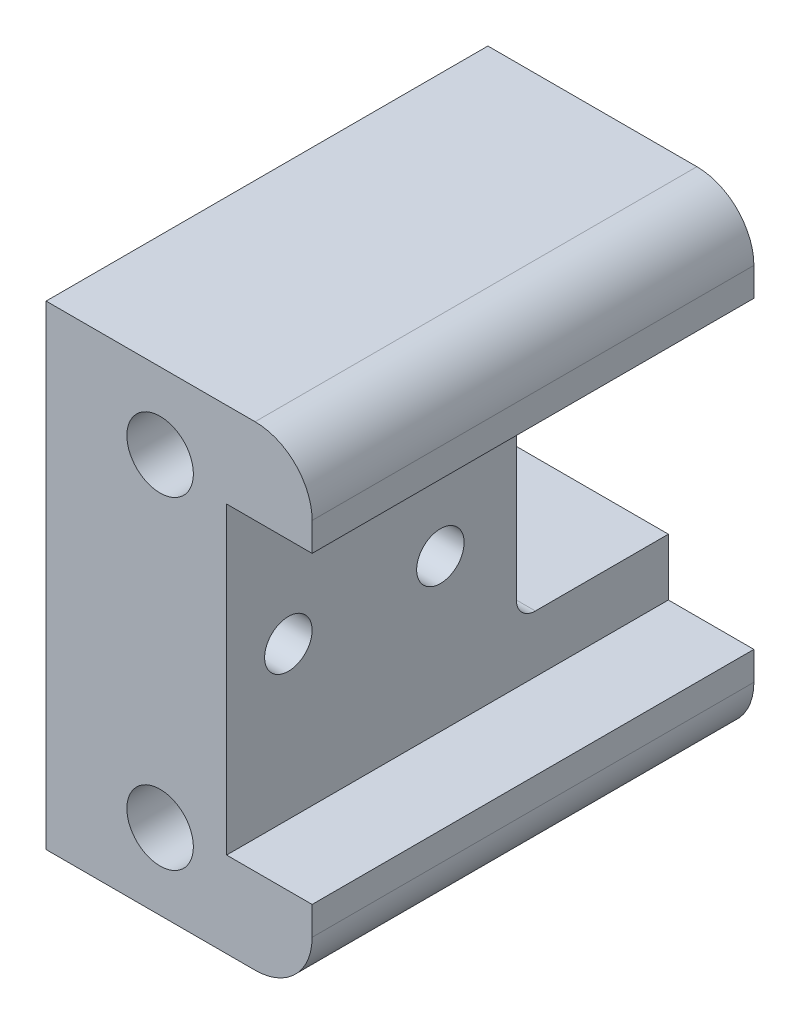
ISO-10303-21;
HEADER;
FILE_DESCRIPTION(('STEP AP214'),'2;1');
FILE_NAME('part.step','',(''),(''),'','','');
FILE_SCHEMA(('AUTOMOTIVE_DESIGN { 1 0 10303 214 1 1 1 1 }'));
ENDSEC;
DATA;
#1=APPLICATION_CONTEXT('core data for automotive mechanical design processes');
#2=APPLICATION_PROTOCOL_DEFINITION('international standard','automotive_design',2000,#1);
#3=PRODUCT_CONTEXT('',#1,'mechanical');
#4=PRODUCT('Part','Part','',(#3));
#5=PRODUCT_RELATED_PRODUCT_CATEGORY('part','',(#4));
#6=PRODUCT_DEFINITION_FORMATION('','',#4);
#7=PRODUCT_DEFINITION_CONTEXT('part definition',#1,'design');
#8=PRODUCT_DEFINITION('design','',#6,#7);
#9=PRODUCT_DEFINITION_SHAPE('','',#8);
#10=(LENGTH_UNIT() NAMED_UNIT(*) SI_UNIT(.MILLI.,.METRE.));
#11=(NAMED_UNIT(*) PLANE_ANGLE_UNIT() SI_UNIT($,.RADIAN.));
#12=(NAMED_UNIT(*) SI_UNIT($,.STERADIAN.) SOLID_ANGLE_UNIT());
#13=UNCERTAINTY_MEASURE_WITH_UNIT(LENGTH_MEASURE(1.E-05),#10,'distance_accuracy_value','');
#14=(GEOMETRIC_REPRESENTATION_CONTEXT(3) GLOBAL_UNCERTAINTY_ASSIGNED_CONTEXT((#13)) GLOBAL_UNIT_ASSIGNED_CONTEXT((#10,
#11,#12)) REPRESENTATION_CONTEXT('',''));
#15=CARTESIAN_POINT('',(0.,0.,0.));
#16=DIRECTION('',(0.,0.,1.));
#17=DIRECTION('',(1.,0.,0.));
#18=AXIS2_PLACEMENT_3D('',#15,#16,#17);
#19=CARTESIAN_POINT('',(-30.3635730743408,221.224854487221,423.302156001649));
#20=DIRECTION('',(1.,0.,0.));
#21=DIRECTION('',(0.,0.,-1.));
#22=AXIS2_PLACEMENT_3D('',#19,#20,#21);
#23=CYLINDRICAL_SURFACE('',#22,1.25);
#24=CARTESIAN_POINT('',(-35.8635719778171,221.224854487221,423.302156001649));
#25=DIRECTION('',(1.,0.,0.));
#26=DIRECTION('',(0.,0.,-1.));
#27=AXIS2_PLACEMENT_3D('',#24,#25,#26);
#28=CIRCLE('',#27,1.25);
#29=CARTESIAN_POINT('',(-35.8635719778171,221.224854487221,422.052156001649));
#30=VERTEX_POINT('',#29);
#31=EDGE_CURVE('E345',#30,#30,#28,.T.);
#32=ORIENTED_EDGE('',*,*,#31,.F.);
#33=EDGE_LOOP('',(#32));
#34=FACE_BOUND('',#33,.T.);
#35=CARTESIAN_POINT('',(-26.3635738851657,221.224854487221,423.302156001649));
#36=DIRECTION('',(-1.,0.,0.));
#37=DIRECTION('',(0.,0.,-1.));
#38=AXIS2_PLACEMENT_3D('',#35,#36,#37);
#39=CIRCLE('',#38,1.25);
#40=CARTESIAN_POINT('',(-26.3635738851657,221.224854487221,422.052156001649));
#41=VERTEX_POINT('',#40);
#42=EDGE_CURVE('E180',#41,#41,#39,.T.);
#43=ORIENTED_EDGE('',*,*,#42,.F.);
#44=EDGE_LOOP('',(#43));
#45=FACE_BOUND('',#44,.T.);
#46=ADVANCED_FACE('F15',(#34,#45),#23,.F.);
#47=CARTESIAN_POINT('',(-30.3635730743408,221.224854487221,431.302156001649));
#48=DIRECTION('',(1.,0.,0.));
#49=DIRECTION('',(0.,0.,-1.));
#50=AXIS2_PLACEMENT_3D('',#47,#48,#49);
#51=CYLINDRICAL_SURFACE('',#50,1.25);
#52=CARTESIAN_POINT('',(-35.8635719778171,221.224854487221,431.302156001649));
#53=DIRECTION('',(1.,0.,0.));
#54=DIRECTION('',(0.,0.,-1.));
#55=AXIS2_PLACEMENT_3D('',#52,#53,#54);
#56=CIRCLE('',#55,1.25);
#57=CARTESIAN_POINT('',(-35.8635719778171,221.224854487221,430.052156001649));
#58=VERTEX_POINT('',#57);
#59=EDGE_CURVE('E272',#58,#58,#56,.T.);
#60=ORIENTED_EDGE('',*,*,#59,.F.);
#61=EDGE_LOOP('',(#60));
#62=FACE_BOUND('',#61,.T.);
#63=CARTESIAN_POINT('',(-26.3635738851657,221.224854487221,431.302156001649));
#64=DIRECTION('',(-1.,0.,0.));
#65=DIRECTION('',(0.,0.,-1.));
#66=AXIS2_PLACEMENT_3D('',#63,#64,#65);
#67=CIRCLE('',#66,1.25);
#68=CARTESIAN_POINT('',(-26.3635738851657,221.224854487221,430.052156001649));
#69=VERTEX_POINT('',#68);
#70=EDGE_CURVE('E337',#69,#69,#67,.T.);
#71=ORIENTED_EDGE('',*,*,#70,.F.);
#72=EDGE_LOOP('',(#71));
#73=FACE_BOUND('',#72,.T.);
#74=ADVANCED_FACE('F299',(#62,#73),#51,.F.);
#75=CARTESIAN_POINT('',(-26.3635738851657,225.224854487221,418.302149832888));
#76=DIRECTION('',(-1.,0.,0.));
#77=DIRECTION('',(0.,0.707106781186573,0.707106781186522));
#78=AXIS2_PLACEMENT_3D('',#75,#76,#77);
#79=CYLINDRICAL_SURFACE('',#78,1.);
#80=CARTESIAN_POINT('',(-26.3635738851657,225.224854487221,418.302149832888));
#81=DIRECTION('',(1.,0.,0.));
#82=DIRECTION('',(0.,0.707106781186573,0.707106781186522));
#83=AXIS2_PLACEMENT_3D('',#80,#81,#82);
#84=CIRCLE('',#83,1.);
#85=CARTESIAN_POINT('',(-26.3635738851657,226.224854487221,418.302149832888));
#86=VERTEX_POINT('',#85);
#87=CARTESIAN_POINT('',(-26.3635738851657,225.224854487221,419.302149832888));
#88=VERTEX_POINT('',#87);
#89=EDGE_CURVE('E10',#86,#88,#84,.T.);
#90=ORIENTED_EDGE('',*,*,#89,.T.);
#91=DIRECTION('',(-1.,0.,0.));
#92=VECTOR('',#91,1.);
#93=CARTESIAN_POINT('',(-26.3635738851657,225.224854487221,419.302149832888));
#94=LINE('',#93,#92);
#95=CARTESIAN_POINT('',(-35.8635719778171,225.224854487221,419.302149832888));
#96=VERTEX_POINT('',#95);
#97=EDGE_CURVE('E25',#88,#96,#94,.T.);
#98=ORIENTED_EDGE('',*,*,#97,.T.);
#99=CARTESIAN_POINT('',(-35.8635719778171,225.224854487221,418.302149832888));
#100=DIRECTION('',(-1.,0.,0.));
#101=DIRECTION('',(0.,0.707106781186573,0.707106781186522));
#102=AXIS2_PLACEMENT_3D('',#99,#100,#101);
#103=CIRCLE('',#102,1.);
#104=CARTESIAN_POINT('',(-35.8635719778171,226.224854487221,418.302149832888));
#105=VERTEX_POINT('',#104);
#106=EDGE_CURVE('E351',#96,#105,#103,.T.);
#107=ORIENTED_EDGE('',*,*,#106,.T.);
#108=DIRECTION('',(1.,0.,0.));
#109=VECTOR('',#108,1.);
#110=CARTESIAN_POINT('',(-26.3635738851657,226.224854487221,418.302149832888));
#111=LINE('',#110,#109);
#112=EDGE_CURVE('E349',#105,#86,#111,.T.);
#113=ORIENTED_EDGE('',*,*,#112,.T.);
#114=EDGE_LOOP('',(#90,#98,#107,#113));
#115=FACE_BOUND('',#114,.T.);
#116=ADVANCED_FACE('F305',(#115),#79,.F.);
#117=CARTESIAN_POINT('',(-26.3635738851657,221.224854487221,419.302149832888));
#118=DIRECTION('',(0.,0.,-1.));
#119=DIRECTION('',(1.,0.,0.));
#120=AXIS2_PLACEMENT_3D('',#117,#118,#119);
#121=PLANE('',#120);
#122=ORIENTED_EDGE('',*,*,#97,.F.);
#123=DIRECTION('',(0.,1.,0.));
#124=VECTOR('',#123,1.);
#125=CARTESIAN_POINT('',(-26.3635738851657,221.224854487221,419.302149832888));
#126=LINE('',#125,#124);
#127=CARTESIAN_POINT('',(-26.3635738851657,217.224854487221,419.302149832888));
#128=VERTEX_POINT('',#127);
#129=EDGE_CURVE('E338',#128,#88,#126,.T.);
#130=ORIENTED_EDGE('',*,*,#129,.F.);
#131=DIRECTION('',(1.,0.,0.));
#132=VECTOR('',#131,1.);
#133=CARTESIAN_POINT('',(-26.3635738851657,217.224854487221,419.302149832888));
#134=LINE('',#133,#132);
#135=CARTESIAN_POINT('',(-35.8635719778171,217.224854487221,419.302149832888));
#136=VERTEX_POINT('',#135);
#137=EDGE_CURVE('E334',#136,#128,#134,.T.);
#138=ORIENTED_EDGE('',*,*,#137,.F.);
#139=DIRECTION('',(0.,-1.,0.));
#140=VECTOR('',#139,1.);
#141=CARTESIAN_POINT('',(-35.8635719778171,221.162354487221,419.302149832888));
#142=LINE('',#141,#140);
#143=EDGE_CURVE('E233',#96,#136,#142,.T.);
#144=ORIENTED_EDGE('',*,*,#143,.F.);
#145=EDGE_LOOP('',(#122,#130,#138,#144));
#146=FACE_BOUND('',#145,.T.);
#147=ADVANCED_FACE('F313',(#146),#121,.T.);
#148=CARTESIAN_POINT('',(-26.3635738851657,217.224854487221,418.302149832888));
#149=DIRECTION('',(1.,0.,0.));
#150=DIRECTION('',(0.,-0.707106781186573,0.707106781186522));
#151=AXIS2_PLACEMENT_3D('',#148,#149,#150);
#152=CYLINDRICAL_SURFACE('',#151,1.);
#153=CARTESIAN_POINT('',(-35.8635719778171,217.224854487221,418.302149832888));
#154=DIRECTION('',(-1.,0.,0.));
#155=DIRECTION('',(0.,-0.707106781186573,0.707106781186522));
#156=AXIS2_PLACEMENT_3D('',#153,#154,#155);
#157=CIRCLE('',#156,1.);
#158=CARTESIAN_POINT('',(-35.8635719778171,216.224854487221,418.302149832888));
#159=VERTEX_POINT('',#158);
#160=EDGE_CURVE('E357',#159,#136,#157,.T.);
#161=ORIENTED_EDGE('',*,*,#160,.T.);
#162=ORIENTED_EDGE('',*,*,#137,.T.);
#163=CARTESIAN_POINT('',(-26.3635738851657,217.224854487221,418.302149832888));
#164=DIRECTION('',(1.,0.,0.));
#165=DIRECTION('',(0.,-0.707106781186573,0.707106781186522));
#166=AXIS2_PLACEMENT_3D('',#163,#164,#165);
#167=CIRCLE('',#166,1.);
#168=CARTESIAN_POINT('',(-26.3635738851657,216.224854487221,418.302149832888));
#169=VERTEX_POINT('',#168);
#170=EDGE_CURVE('E329',#128,#169,#167,.T.);
#171=ORIENTED_EDGE('',*,*,#170,.T.);
#172=DIRECTION('',(-1.,0.,0.));
#173=VECTOR('',#172,1.);
#174=CARTESIAN_POINT('',(-26.3635738851657,216.224854487221,418.302149832888));
#175=LINE('',#174,#173);
#176=EDGE_CURVE('E325',#169,#159,#175,.T.);
#177=ORIENTED_EDGE('',*,*,#176,.T.);
#178=EDGE_LOOP('',(#161,#162,#171,#177));
#179=FACE_BOUND('',#178,.T.);
#180=ADVANCED_FACE('F317',(#179),#152,.F.);
#181=CARTESIAN_POINT('',(-26.3635738851657,216.224854487221,419.802163631044));
#182=DIRECTION('',(0.,1.,0.));
#183=DIRECTION('',(1.,0.,0.));
#184=AXIS2_PLACEMENT_3D('',#181,#182,#183);
#185=PLANE('',#184);
#186=ORIENTED_EDGE('',*,*,#176,.F.);
#187=DIRECTION('',(0.,0.,1.));
#188=VECTOR('',#187,1.);
#189=CARTESIAN_POINT('',(-26.3635738851657,216.224854487221,422.552167445741));
#190=LINE('',#189,#188);
#191=CARTESIAN_POINT('',(-26.3635738851657,216.224854487221,411.302156001649));
#192=VERTEX_POINT('',#191);
#193=EDGE_CURVE('E327',#192,#169,#190,.T.);
#194=ORIENTED_EDGE('',*,*,#193,.F.);
#195=DIRECTION('',(-1.,0.,0.));
#196=VECTOR('',#195,1.);
#197=CARTESIAN_POINT('',(-26.6135738851657,216.224854487221,411.302156001649));
#198=LINE('',#197,#196);
#199=CARTESIAN_POINT('',(-35.8635719778171,216.224854487221,411.302156001649));
#200=VERTEX_POINT('',#199);
#201=EDGE_CURVE('E253',#192,#200,#198,.T.);
#202=ORIENTED_EDGE('',*,*,#201,.T.);
#203=DIRECTION('',(0.,0.,-1.));
#204=VECTOR('',#203,1.);
#205=CARTESIAN_POINT('',(-35.8635719778171,216.224854487221,427.177159816346));
#206=LINE('',#205,#204);
#207=EDGE_CURVE('E269',#159,#200,#206,.T.);
#208=ORIENTED_EDGE('',*,*,#207,.F.);
#209=EDGE_LOOP('',(#186,#194,#202,#208));
#210=FACE_BOUND('',#209,.T.);
#211=ADVANCED_FACE('F293',(#210),#185,.T.);
#212=CARTESIAN_POINT('',(-26.3635738851657,226.224854487221,419.802163631044));
#213=DIRECTION('',(0.,-1.,0.));
#214=DIRECTION('',(-1.,0.,0.));
#215=AXIS2_PLACEMENT_3D('',#212,#213,#214);
#216=PLANE('',#215);
#217=ORIENTED_EDGE('',*,*,#112,.F.);
#218=DIRECTION('',(0.,0.,1.));
#219=VECTOR('',#218,1.);
#220=CARTESIAN_POINT('',(-35.8635719778171,226.224854487221,427.177159816346));
#221=LINE('',#220,#219);
#222=CARTESIAN_POINT('',(-35.8635719778171,226.224854487221,411.302156001649));
#223=VERTEX_POINT('',#222);
#224=EDGE_CURVE('E270',#223,#105,#221,.T.);
#225=ORIENTED_EDGE('',*,*,#224,.F.);
#226=DIRECTION('',(1.,0.,0.));
#227=VECTOR('',#226,1.);
#228=CARTESIAN_POINT('',(-26.6135738851657,226.224854487221,411.302156001649));
#229=LINE('',#228,#227);
#230=CARTESIAN_POINT('',(-26.3635738851657,226.224854487221,411.302156001649));
#231=VERTEX_POINT('',#230);
#232=EDGE_CURVE('E221',#223,#231,#229,.T.);
#233=ORIENTED_EDGE('',*,*,#232,.T.);
#234=DIRECTION('',(0.,0.,-1.));
#235=VECTOR('',#234,1.);
#236=CARTESIAN_POINT('',(-26.3635738851657,226.224854487221,422.552167445741));
#237=LINE('',#236,#235);
#238=EDGE_CURVE('E186',#86,#231,#237,.T.);
#239=ORIENTED_EDGE('',*,*,#238,.F.);
#240=EDGE_LOOP('',(#217,#225,#233,#239));
#241=FACE_BOUND('',#240,.T.);
#242=ADVANCED_FACE('F282',(#241),#216,.T.);
#243=CARTESIAN_POINT('',(-35.8635719778171,221.099854487221,434.552156001649));
#244=DIRECTION('',(-1.,0.,0.));
#245=DIRECTION('',(0.,-1.,0.));
#246=AXIS2_PLACEMENT_3D('',#243,#244,#245);
#247=PLANE('',#246);
#248=ORIENTED_EDGE('',*,*,#31,.T.);
#249=EDGE_LOOP('',(#248));
#250=FACE_BOUND('',#249,.T.);
#251=ORIENTED_EDGE('',*,*,#59,.T.);
#252=EDGE_LOOP('',(#251));
#253=FACE_BOUND('',#252,.T.);
#254=ORIENTED_EDGE('',*,*,#207,.T.);
#255=DIRECTION('',(0.,1.,0.));
#256=VECTOR('',#255,1.);
#257=CARTESIAN_POINT('',(-35.8635719778171,221.162354487221,411.302156001649));
#258=LINE('',#257,#256);
#259=CARTESIAN_POINT('',(-35.8635719778171,208.724854487221,411.302156001649));
#260=VERTEX_POINT('',#259);
#261=EDGE_CURVE('E173',#260,#200,#258,.T.);
#262=ORIENTED_EDGE('',*,*,#261,.F.);
#263=DIRECTION('',(0.,0.,1.));
#264=VECTOR('',#263,1.);
#265=CARTESIAN_POINT('',(-35.8635719778171,208.724854487221,428.802156001649));
#266=LINE('',#265,#264);
#267=CARTESIAN_POINT('',(-35.8635719778171,208.724854487221,434.552156001649));
#268=VERTEX_POINT('',#267);
#269=EDGE_CURVE('E268',#260,#268,#266,.T.);
#270=ORIENTED_EDGE('',*,*,#269,.T.);
#271=DIRECTION('',(0.,-1.,0.));
#272=VECTOR('',#271,1.);
#273=CARTESIAN_POINT('',(-35.8635719778171,221.162354487221,434.552156001649));
#274=LINE('',#273,#272);
#275=CARTESIAN_POINT('',(-35.8635719778171,233.724854487221,434.552156001649));
#276=VERTEX_POINT('',#275);
#277=EDGE_CURVE('E199',#276,#268,#274,.T.);
#278=ORIENTED_EDGE('',*,*,#277,.F.);
#279=DIRECTION('',(0.,0.,1.));
#280=VECTOR('',#279,1.);
#281=CARTESIAN_POINT('',(-35.8635719778171,233.724854487221,428.802156001649));
#282=LINE('',#281,#280);
#283=CARTESIAN_POINT('',(-35.8635719778171,233.724854487221,411.302156001649));
#284=VERTEX_POINT('',#283);
#285=EDGE_CURVE('E143',#284,#276,#282,.T.);
#286=ORIENTED_EDGE('',*,*,#285,.F.);
#287=DIRECTION('',(0.,1.,0.));
#288=VECTOR('',#287,1.);
#289=CARTESIAN_POINT('',(-35.8635719778171,221.162354487221,411.302156001649));
#290=LINE('',#289,#288);
#291=EDGE_CURVE('E175',#223,#284,#290,.T.);
#292=ORIENTED_EDGE('',*,*,#291,.F.);
#293=ORIENTED_EDGE('',*,*,#224,.T.);
#294=ORIENTED_EDGE('',*,*,#106,.F.);
#295=ORIENTED_EDGE('',*,*,#143,.T.);
#296=ORIENTED_EDGE('',*,*,#160,.F.);
#297=EDGE_LOOP('',(#254,#262,#270,#278,#286,#292,#293,#294,#295,#296));
#298=FACE_BOUND('',#297,.T.);
#299=ADVANCED_FACE('F277',(#250,#253,#298),#247,.T.);
#300=CARTESIAN_POINT('',(-29.8635738851656,212.724854487221,423.052171260438));
#301=DIRECTION('',(0.,0.,-1.));
#302=DIRECTION('',(0.,-1.,0.));
#303=AXIS2_PLACEMENT_3D('',#300,#301,#302);
#304=CYLINDRICAL_SURFACE('',#303,1.75);
#305=CARTESIAN_POINT('',(-29.8635738851656,212.724854487221,411.302156001649));
#306=DIRECTION('',(0.,0.,1.));
#307=DIRECTION('',(0.,-1.,0.));
#308=AXIS2_PLACEMENT_3D('',#305,#306,#307);
#309=CIRCLE('',#308,1.75);
#310=CARTESIAN_POINT('',(-29.8635738851656,210.974854487221,411.302156001649));
#311=VERTEX_POINT('',#310);
#312=EDGE_CURVE('E230',#311,#311,#309,.T.);
#313=ORIENTED_EDGE('',*,*,#312,.F.);
#314=EDGE_LOOP('',(#313));
#315=FACE_BOUND('',#314,.T.);
#316=CARTESIAN_POINT('',(-29.8635738851656,212.724854487221,434.552156001649));
#317=DIRECTION('',(0.,0.,-1.));
#318=DIRECTION('',(0.,-1.,0.));
#319=AXIS2_PLACEMENT_3D('',#316,#317,#318);
#320=CIRCLE('',#319,1.75);
#321=CARTESIAN_POINT('',(-29.8635738851656,210.974854487221,434.552156001649));
#322=VERTEX_POINT('',#321);
#323=EDGE_CURVE('E145',#322,#322,#320,.T.);
#324=ORIENTED_EDGE('',*,*,#323,.F.);
#325=EDGE_LOOP('',(#324));
#326=FACE_BOUND('',#325,.T.);
#327=ADVANCED_FACE('F281',(#315,#326),#304,.F.);
#328=CARTESIAN_POINT('',(-29.8635738851656,229.724854487221,423.052171260438));
#329=DIRECTION('',(0.,0.,-1.));
#330=DIRECTION('',(0.,-1.,0.));
#331=AXIS2_PLACEMENT_3D('',#328,#329,#330);
#332=CYLINDRICAL_SURFACE('',#331,1.75);
#333=CARTESIAN_POINT('',(-29.8635738851656,229.724854487221,411.302156001649));
#334=DIRECTION('',(0.,0.,1.));
#335=DIRECTION('',(0.,-1.,0.));
#336=AXIS2_PLACEMENT_3D('',#333,#334,#335);
#337=CIRCLE('',#336,1.75);
#338=CARTESIAN_POINT('',(-29.8635738851656,227.974854487221,411.302156001649));
#339=VERTEX_POINT('',#338);
#340=EDGE_CURVE('E224',#339,#339,#337,.T.);
#341=ORIENTED_EDGE('',*,*,#340,.F.);
#342=EDGE_LOOP('',(#341));
#343=FACE_BOUND('',#342,.T.);
#344=CARTESIAN_POINT('',(-29.8635738851656,229.724854487221,434.552156001649));
#345=DIRECTION('',(0.,0.,-1.));
#346=DIRECTION('',(0.,-1.,0.));
#347=AXIS2_PLACEMENT_3D('',#344,#345,#346);
#348=CIRCLE('',#347,1.75);
#349=CARTESIAN_POINT('',(-29.8635738851656,227.974854487221,434.552156001649));
#350=VERTEX_POINT('',#349);
#351=EDGE_CURVE('E236',#350,#350,#348,.T.);
#352=ORIENTED_EDGE('',*,*,#351,.F.);
#353=EDGE_LOOP('',(#352));
#354=FACE_BOUND('',#353,.T.);
#355=ADVANCED_FACE('F290',(#343,#354),#332,.F.);
#356=CARTESIAN_POINT('',(-26.8635738851657,221.224854487221,411.302156001649));
#357=DIRECTION('',(0.,0.,-1.));
#358=DIRECTION('',(0.,-1.,0.));
#359=AXIS2_PLACEMENT_3D('',#356,#357,#358);
#360=PLANE('',#359);
#361=ORIENTED_EDGE('',*,*,#312,.T.);
#362=EDGE_LOOP('',(#361));
#363=FACE_BOUND('',#362,.T.);
#364=ORIENTED_EDGE('',*,*,#201,.F.);
#365=DIRECTION('',(0.,1.,0.));
#366=VECTOR('',#365,1.);
#367=CARTESIAN_POINT('',(-26.3635738851657,221.224854487221,411.302156001649));
#368=LINE('',#367,#366);
#369=CARTESIAN_POINT('',(-26.3635738851657,213.224854487221,411.302156001649));
#370=VERTEX_POINT('',#369);
#371=EDGE_CURVE('E190',#370,#192,#368,.T.);
#372=ORIENTED_EDGE('',*,*,#371,.F.);
#373=DIRECTION('',(-1.,0.,0.));
#374=VECTOR('',#373,1.);
#375=CARTESIAN_POINT('',(-25.3635738851657,213.224854487221,411.302156001649));
#376=LINE('',#375,#374);
#377=CARTESIAN_POINT('',(-21.8635738851657,213.224854487221,411.302156001649));
#378=VERTEX_POINT('',#377);
#379=EDGE_CURVE('E196',#378,#370,#376,.T.);
#380=ORIENTED_EDGE('',*,*,#379,.F.);
#381=DIRECTION('',(0.,-1.,0.));
#382=VECTOR('',#381,1.);
#383=CARTESIAN_POINT('',(-21.8635738851657,221.224854487221,411.302156001649));
#384=LINE('',#383,#382);
#385=CARTESIAN_POINT('',(-21.8635738851657,211.724854487221,411.302156001649));
#386=VERTEX_POINT('',#385);
#387=EDGE_CURVE('E168',#378,#386,#384,.T.);
#388=ORIENTED_EDGE('',*,*,#387,.T.);
#389=CARTESIAN_POINT('',(-24.8635738851656,211.724854487221,411.302156001649));
#390=DIRECTION('',(0.,0.,1.));
#391=DIRECTION('',(0.707106781186552,-0.707106781186543,0.));
#392=AXIS2_PLACEMENT_3D('',#389,#390,#391);
#393=CIRCLE('',#392,3.);
#394=CARTESIAN_POINT('',(-24.8635738851656,208.724854487221,411.302156001649));
#395=VERTEX_POINT('',#394);
#396=EDGE_CURVE('E159',#395,#386,#393,.T.);
#397=ORIENTED_EDGE('',*,*,#396,.F.);
#398=DIRECTION('',(-1.,0.,0.));
#399=VECTOR('',#398,1.);
#400=CARTESIAN_POINT('',(-26.8635738851657,208.724854487221,411.302156001649));
#401=LINE('',#400,#399);
#402=EDGE_CURVE('E170',#395,#260,#401,.T.);
#403=ORIENTED_EDGE('',*,*,#402,.T.);
#404=ORIENTED_EDGE('',*,*,#261,.T.);
#405=EDGE_LOOP('',(#364,#372,#380,#388,#397,#403,#404));
#406=FACE_BOUND('',#405,.T.);
#407=ADVANCED_FACE('F250',(#363,#406),#360,.T.);
#408=CARTESIAN_POINT('',(-26.8635738851657,221.224854487221,411.302156001649));
#409=DIRECTION('',(0.,0.,-1.));
#410=DIRECTION('',(0.,-1.,0.));
#411=AXIS2_PLACEMENT_3D('',#408,#409,#410);
#412=PLANE('',#411);
#413=ORIENTED_EDGE('',*,*,#340,.T.);
#414=EDGE_LOOP('',(#413));
#415=FACE_BOUND('',#414,.T.);
#416=ORIENTED_EDGE('',*,*,#232,.F.);
#417=ORIENTED_EDGE('',*,*,#291,.T.);
#418=DIRECTION('',(1.,0.,0.));
#419=VECTOR('',#418,1.);
#420=CARTESIAN_POINT('',(-26.8635738851657,233.724854487221,411.302156001649));
#421=LINE('',#420,#419);
#422=CARTESIAN_POINT('',(-24.8635738851656,233.724854487221,411.302156001649));
#423=VERTEX_POINT('',#422);
#424=EDGE_CURVE('E174',#284,#423,#421,.T.);
#425=ORIENTED_EDGE('',*,*,#424,.T.);
#426=CARTESIAN_POINT('',(-24.8635738851656,230.724854487221,411.302156001649));
#427=DIRECTION('',(0.,0.,1.));
#428=DIRECTION('',(0.707106781186552,0.707106781186544,0.));
#429=AXIS2_PLACEMENT_3D('',#426,#427,#428);
#430=CIRCLE('',#429,3.);
#431=CARTESIAN_POINT('',(-21.8635738851657,230.724854487221,411.302156001649));
#432=VERTEX_POINT('',#431);
#433=EDGE_CURVE('E148',#432,#423,#430,.T.);
#434=ORIENTED_EDGE('',*,*,#433,.F.);
#435=DIRECTION('',(0.,-1.,0.));
#436=VECTOR('',#435,1.);
#437=CARTESIAN_POINT('',(-21.8635738851657,221.224854487221,411.302156001649));
#438=LINE('',#437,#436);
#439=CARTESIAN_POINT('',(-21.8635738851657,229.224854487221,411.302156001649));
#440=VERTEX_POINT('',#439);
#441=EDGE_CURVE('E176',#432,#440,#438,.T.);
#442=ORIENTED_EDGE('',*,*,#441,.T.);
#443=DIRECTION('',(1.,0.,0.));
#444=VECTOR('',#443,1.);
#445=CARTESIAN_POINT('',(-25.3635738851657,229.224854487221,411.302156001649));
#446=LINE('',#445,#444);
#447=CARTESIAN_POINT('',(-26.3635738851657,229.224854487221,411.302156001649));
#448=VERTEX_POINT('',#447);
#449=EDGE_CURVE('E135',#448,#440,#446,.T.);
#450=ORIENTED_EDGE('',*,*,#449,.F.);
#451=DIRECTION('',(0.,1.,0.));
#452=VECTOR('',#451,1.);
#453=CARTESIAN_POINT('',(-26.3635738851657,221.224854487221,411.302156001649));
#454=LINE('',#453,#452);
#455=EDGE_CURVE('E183',#231,#448,#454,.T.);
#456=ORIENTED_EDGE('',*,*,#455,.F.);
#457=EDGE_LOOP('',(#416,#417,#425,#434,#442,#450,#456));
#458=FACE_BOUND('',#457,.T.);
#459=ADVANCED_FACE('F216',(#415,#458),#412,.T.);
#460=CARTESIAN_POINT('',(-26.3635738851657,221.224854487221,425.302171260438));
#461=DIRECTION('',(1.,0.,0.));
#462=DIRECTION('',(0.,0.,1.));
#463=AXIS2_PLACEMENT_3D('',#460,#461,#462);
#464=PLANE('',#463);
#465=ORIENTED_EDGE('',*,*,#42,.T.);
#466=EDGE_LOOP('',(#465));
#467=FACE_BOUND('',#466,.T.);
#468=ORIENTED_EDGE('',*,*,#70,.T.);
#469=EDGE_LOOP('',(#468));
#470=FACE_BOUND('',#469,.T.);
#471=ORIENTED_EDGE('',*,*,#193,.T.);
#472=ORIENTED_EDGE('',*,*,#170,.F.);
#473=ORIENTED_EDGE('',*,*,#129,.T.);
#474=ORIENTED_EDGE('',*,*,#89,.F.);
#475=ORIENTED_EDGE('',*,*,#238,.T.);
#476=ORIENTED_EDGE('',*,*,#455,.T.);
#477=DIRECTION('',(0.,0.,1.));
#478=VECTOR('',#477,1.);
#479=CARTESIAN_POINT('',(-26.3635738851657,229.224854487221,425.302171260438));
#480=LINE('',#479,#478);
#481=CARTESIAN_POINT('',(-26.3635738851657,229.224854487221,434.552156001649));
#482=VERTEX_POINT('',#481);
#483=EDGE_CURVE('E187',#448,#482,#480,.T.);
#484=ORIENTED_EDGE('',*,*,#483,.T.);
#485=DIRECTION('',(0.,1.,0.));
#486=VECTOR('',#485,1.);
#487=CARTESIAN_POINT('',(-26.3635738851657,221.224854487221,434.552156001649));
#488=LINE('',#487,#486);
#489=CARTESIAN_POINT('',(-26.3635738851657,213.224854487221,434.552156001649));
#490=VERTEX_POINT('',#489);
#491=EDGE_CURVE('E191',#490,#482,#488,.T.);
#492=ORIENTED_EDGE('',*,*,#491,.F.);
#493=DIRECTION('',(0.,0.,1.));
#494=VECTOR('',#493,1.);
#495=CARTESIAN_POINT('',(-26.3635738851657,213.224854487221,425.302171260438));
#496=LINE('',#495,#494);
#497=EDGE_CURVE('E182',#370,#490,#496,.T.);
#498=ORIENTED_EDGE('',*,*,#497,.F.);
#499=ORIENTED_EDGE('',*,*,#371,.T.);
#500=EDGE_LOOP('',(#471,#472,#473,#474,#475,#476,#484,#492,#498,#499));
#501=FACE_BOUND('',#500,.T.);
#502=ADVANCED_FACE('F256',(#467,#470,#501),#464,.T.);
#503=CARTESIAN_POINT('',(-26.8635738851657,221.224854487221,434.552156001649));
#504=DIRECTION('',(0.,0.,-1.));
#505=DIRECTION('',(0.,-1.,0.));
#506=AXIS2_PLACEMENT_3D('',#503,#504,#505);
#507=PLANE('',#506);
#508=ORIENTED_EDGE('',*,*,#351,.T.);
#509=EDGE_LOOP('',(#508));
#510=FACE_BOUND('',#509,.T.);
#511=ORIENTED_EDGE('',*,*,#277,.T.);
#512=DIRECTION('',(1.,0.,0.));
#513=VECTOR('',#512,1.);
#514=CARTESIAN_POINT('',(-26.8635738851657,208.724854487221,434.552156001649));
#515=LINE('',#514,#513);
#516=CARTESIAN_POINT('',(-24.8635738851656,208.724854487221,434.552156001649));
#517=VERTEX_POINT('',#516);
#518=EDGE_CURVE('E197',#268,#517,#515,.T.);
#519=ORIENTED_EDGE('',*,*,#518,.T.);
#520=CARTESIAN_POINT('',(-24.8635738851656,211.724854487221,434.552156001649));
#521=DIRECTION('',(0.,0.,-1.));
#522=DIRECTION('',(0.707106781186552,-0.707106781186543,0.));
#523=AXIS2_PLACEMENT_3D('',#520,#521,#522);
#524=CIRCLE('',#523,3.);
#525=CARTESIAN_POINT('',(-21.8635738851657,211.724854487221,434.552156001649));
#526=VERTEX_POINT('',#525);
#527=EDGE_CURVE('E152',#526,#517,#524,.T.);
#528=ORIENTED_EDGE('',*,*,#527,.F.);
#529=DIRECTION('',(0.,1.,0.));
#530=VECTOR('',#529,1.);
#531=CARTESIAN_POINT('',(-21.8635738851657,221.224854487221,434.552156001649));
#532=LINE('',#531,#530);
#533=CARTESIAN_POINT('',(-21.8635738851657,213.224854487221,434.552156001649));
#534=VERTEX_POINT('',#533);
#535=EDGE_CURVE('E200',#526,#534,#532,.T.);
#536=ORIENTED_EDGE('',*,*,#535,.T.);
#537=DIRECTION('',(-1.,0.,0.));
#538=VECTOR('',#537,1.);
#539=CARTESIAN_POINT('',(-25.3635738851657,213.224854487221,434.552156001649));
#540=LINE('',#539,#538);
#541=EDGE_CURVE('E193',#534,#490,#540,.T.);
#542=ORIENTED_EDGE('',*,*,#541,.T.);
#543=ORIENTED_EDGE('',*,*,#491,.T.);
#544=DIRECTION('',(1.,0.,0.));
#545=VECTOR('',#544,1.);
#546=CARTESIAN_POINT('',(-25.3635738851657,229.224854487221,434.552156001649));
#547=LINE('',#546,#545);
#548=CARTESIAN_POINT('',(-21.8635738851657,229.224854487221,434.552156001649));
#549=VERTEX_POINT('',#548);
#550=EDGE_CURVE('E194',#482,#549,#547,.T.);
#551=ORIENTED_EDGE('',*,*,#550,.T.);
#552=DIRECTION('',(0.,1.,0.));
#553=VECTOR('',#552,1.);
#554=CARTESIAN_POINT('',(-21.8635738851657,221.224854487221,434.552156001649));
#555=LINE('',#554,#553);
#556=CARTESIAN_POINT('',(-21.8635738851657,230.724854487221,434.552156001649));
#557=VERTEX_POINT('',#556);
#558=EDGE_CURVE('E133',#549,#557,#555,.T.);
#559=ORIENTED_EDGE('',*,*,#558,.T.);
#560=CARTESIAN_POINT('',(-24.8635738851656,230.724854487221,434.552156001649));
#561=DIRECTION('',(0.,0.,-1.));
#562=DIRECTION('',(0.707106781186552,0.707106781186544,0.));
#563=AXIS2_PLACEMENT_3D('',#560,#561,#562);
#564=CIRCLE('',#563,3.);
#565=CARTESIAN_POINT('',(-24.8635738851656,233.724854487221,434.552156001649));
#566=VERTEX_POINT('',#565);
#567=EDGE_CURVE('E124',#566,#557,#564,.T.);
#568=ORIENTED_EDGE('',*,*,#567,.F.);
#569=DIRECTION('',(-1.,0.,0.));
#570=VECTOR('',#569,1.);
#571=CARTESIAN_POINT('',(-26.8635738851657,233.724854487221,434.552156001649));
#572=LINE('',#571,#570);
#573=EDGE_CURVE('E131',#566,#276,#572,.T.);
#574=ORIENTED_EDGE('',*,*,#573,.T.);
#575=EDGE_LOOP('',(#511,#519,#528,#536,#542,#543,#551,#559,#568,#574));
#576=FACE_BOUND('',#575,.T.);
#577=ORIENTED_EDGE('',*,*,#323,.T.);
#578=EDGE_LOOP('',(#577));
#579=FACE_BOUND('',#578,.T.);
#580=ADVANCED_FACE('F129',(#510,#576,#579),#507,.F.);
#581=CARTESIAN_POINT('',(-21.8635738851657,221.224854487221,423.052156001649));
#582=DIRECTION('',(-1.,0.,0.));
#583=DIRECTION('',(0.,0.,-1.));
#584=AXIS2_PLACEMENT_3D('',#581,#582,#583);
#585=PLANE('',#584);
#586=DIRECTION('',(0.,0.,-1.));
#587=VECTOR('',#586,1.);
#588=CARTESIAN_POINT('',(-21.8635738851657,229.224854487221,424.177163631043));
#589=LINE('',#588,#587);
#590=EDGE_CURVE('E208',#549,#440,#589,.T.);
#591=ORIENTED_EDGE('',*,*,#590,.T.);
#592=ORIENTED_EDGE('',*,*,#441,.F.);
#593=DIRECTION('',(0.,0.,-1.));
#594=VECTOR('',#593,1.);
#595=CARTESIAN_POINT('',(-21.8635738851657,230.724854487221,423.052156001649));
#596=LINE('',#595,#594);
#597=EDGE_CURVE('E136',#557,#432,#596,.T.);
#598=ORIENTED_EDGE('',*,*,#597,.F.);
#599=ORIENTED_EDGE('',*,*,#558,.F.);
#600=EDGE_LOOP('',(#591,#592,#598,#599));
#601=FACE_BOUND('',#600,.T.);
#602=ADVANCED_FACE('F212',(#601),#585,.F.);
#603=CARTESIAN_POINT('',(-23.8635738851657,213.224854487221,425.302171260438));
#604=DIRECTION('',(0.,1.,0.));
#605=DIRECTION('',(0.,0.,-1.));
#606=AXIS2_PLACEMENT_3D('',#603,#604,#605);
#607=PLANE('',#606);
#608=ORIENTED_EDGE('',*,*,#379,.T.);
#609=ORIENTED_EDGE('',*,*,#497,.T.);
#610=ORIENTED_EDGE('',*,*,#541,.F.);
#611=DIRECTION('',(0.,0.,1.));
#612=VECTOR('',#611,1.);
#613=CARTESIAN_POINT('',(-21.8635738851657,213.224854487221,424.177163631043));
#614=LINE('',#613,#612);
#615=EDGE_CURVE('E155',#378,#534,#614,.T.);
#616=ORIENTED_EDGE('',*,*,#615,.F.);
#617=EDGE_LOOP('',(#608,#609,#610,#616));
#618=FACE_BOUND('',#617,.T.);
#619=ADVANCED_FACE('F243',(#618),#607,.T.);
#620=CARTESIAN_POINT('',(-23.8635738851657,229.224854487221,425.302171260438));
#621=DIRECTION('',(0.,-1.,0.));
#622=DIRECTION('',(0.,0.,1.));
#623=AXIS2_PLACEMENT_3D('',#620,#621,#622);
#624=PLANE('',#623);
#625=ORIENTED_EDGE('',*,*,#449,.T.);
#626=ORIENTED_EDGE('',*,*,#590,.F.);
#627=ORIENTED_EDGE('',*,*,#550,.F.);
#628=ORIENTED_EDGE('',*,*,#483,.F.);
#629=EDGE_LOOP('',(#625,#626,#627,#628));
#630=FACE_BOUND('',#629,.T.);
#631=ADVANCED_FACE('F385',(#630),#624,.T.);
#632=CARTESIAN_POINT('',(-24.8635738851656,230.724854487221,423.052156001649));
#633=DIRECTION('',(0.,0.,1.));
#634=DIRECTION('',(0.707106781186552,0.707106781186544,0.));
#635=AXIS2_PLACEMENT_3D('',#632,#633,#634);
#636=CYLINDRICAL_SURFACE('',#635,3.);
#637=ORIENTED_EDGE('',*,*,#567,.T.);
#638=ORIENTED_EDGE('',*,*,#597,.T.);
#639=ORIENTED_EDGE('',*,*,#433,.T.);
#640=DIRECTION('',(0.,0.,1.));
#641=VECTOR('',#640,1.);
#642=CARTESIAN_POINT('',(-24.8635738851656,233.724854487221,423.052156001649));
#643=LINE('',#642,#641);
#644=EDGE_CURVE('E142',#423,#566,#643,.T.);
#645=ORIENTED_EDGE('',*,*,#644,.T.);
#646=EDGE_LOOP('',(#637,#638,#639,#645));
#647=FACE_BOUND('',#646,.T.);
#648=ADVANCED_FACE('F147',(#647),#636,.T.);
#649=CARTESIAN_POINT('',(-26.8635738851657,233.724854487221,423.052156001649));
#650=DIRECTION('',(0.,-1.,0.));
#651=DIRECTION('',(0.,0.,1.));
#652=AXIS2_PLACEMENT_3D('',#649,#650,#651);
#653=PLANE('',#652);
#654=ORIENTED_EDGE('',*,*,#644,.F.);
#655=ORIENTED_EDGE('',*,*,#424,.F.);
#656=ORIENTED_EDGE('',*,*,#285,.T.);
#657=ORIENTED_EDGE('',*,*,#573,.F.);
#658=EDGE_LOOP('',(#654,#655,#656,#657));
#659=FACE_BOUND('',#658,.T.);
#660=ADVANCED_FACE('F140',(#659),#653,.F.);
#661=CARTESIAN_POINT('',(-24.8635738851656,211.724854487221,423.052156001649));
#662=DIRECTION('',(0.,0.,1.));
#663=DIRECTION('',(0.707106781186552,-0.707106781186543,0.));
#664=AXIS2_PLACEMENT_3D('',#661,#662,#663);
#665=CYLINDRICAL_SURFACE('',#664,3.);
#666=ORIENTED_EDGE('',*,*,#527,.T.);
#667=DIRECTION('',(0.,0.,-1.));
#668=VECTOR('',#667,1.);
#669=CARTESIAN_POINT('',(-24.8635738851656,208.724854487221,423.052156001649));
#670=LINE('',#669,#668);
#671=EDGE_CURVE('E157',#517,#395,#670,.T.);
#672=ORIENTED_EDGE('',*,*,#671,.T.);
#673=ORIENTED_EDGE('',*,*,#396,.T.);
#674=DIRECTION('',(0.,0.,1.));
#675=VECTOR('',#674,1.);
#676=CARTESIAN_POINT('',(-21.8635738851657,211.724854487221,423.052156001649));
#677=LINE('',#676,#675);
#678=EDGE_CURVE('E19',#386,#526,#677,.T.);
#679=ORIENTED_EDGE('',*,*,#678,.T.);
#680=EDGE_LOOP('',(#666,#672,#673,#679));
#681=FACE_BOUND('',#680,.T.);
#682=ADVANCED_FACE('F393',(#681),#665,.T.);
#683=CARTESIAN_POINT('',(-26.8635738851657,208.724854487221,423.052156001649));
#684=DIRECTION('',(0.,1.,0.));
#685=DIRECTION('',(0.,0.,-1.));
#686=AXIS2_PLACEMENT_3D('',#683,#684,#685);
#687=PLANE('',#686);
#688=ORIENTED_EDGE('',*,*,#671,.F.);
#689=ORIENTED_EDGE('',*,*,#518,.F.);
#690=ORIENTED_EDGE('',*,*,#269,.F.);
#691=ORIENTED_EDGE('',*,*,#402,.F.);
#692=EDGE_LOOP('',(#688,#689,#690,#691));
#693=FACE_BOUND('',#692,.T.);
#694=ADVANCED_FACE('F265',(#693),#687,.F.);
#695=CARTESIAN_POINT('',(-21.8635738851657,221.224854487221,423.052156001649));
#696=DIRECTION('',(-1.,0.,0.));
#697=DIRECTION('',(0.,0.,-1.));
#698=AXIS2_PLACEMENT_3D('',#695,#696,#697);
#699=PLANE('',#698);
#700=ORIENTED_EDGE('',*,*,#387,.F.);
#701=ORIENTED_EDGE('',*,*,#615,.T.);
#702=ORIENTED_EDGE('',*,*,#535,.F.);
#703=ORIENTED_EDGE('',*,*,#678,.F.);
#704=EDGE_LOOP('',(#700,#701,#702,#703));
#705=FACE_BOUND('',#704,.T.);
#706=ADVANCED_FACE('F17',(#705),#699,.F.);
#707=CLOSED_SHELL('',(#46,#74,#116,#147,#180,#211,#242,#299,#327,#355,#407,#459,#502,#580,#602,
#619,#631,#648,#660,#682,#694,#706));
#708=MANIFOLD_SOLID_BREP('B1',#707);
#709=ADVANCED_BREP_SHAPE_REPRESENTATION('',(#18,#708),#14);
#710=SHAPE_DEFINITION_REPRESENTATION(#9,#709);
ENDSEC;
END-ISO-10303-21;
